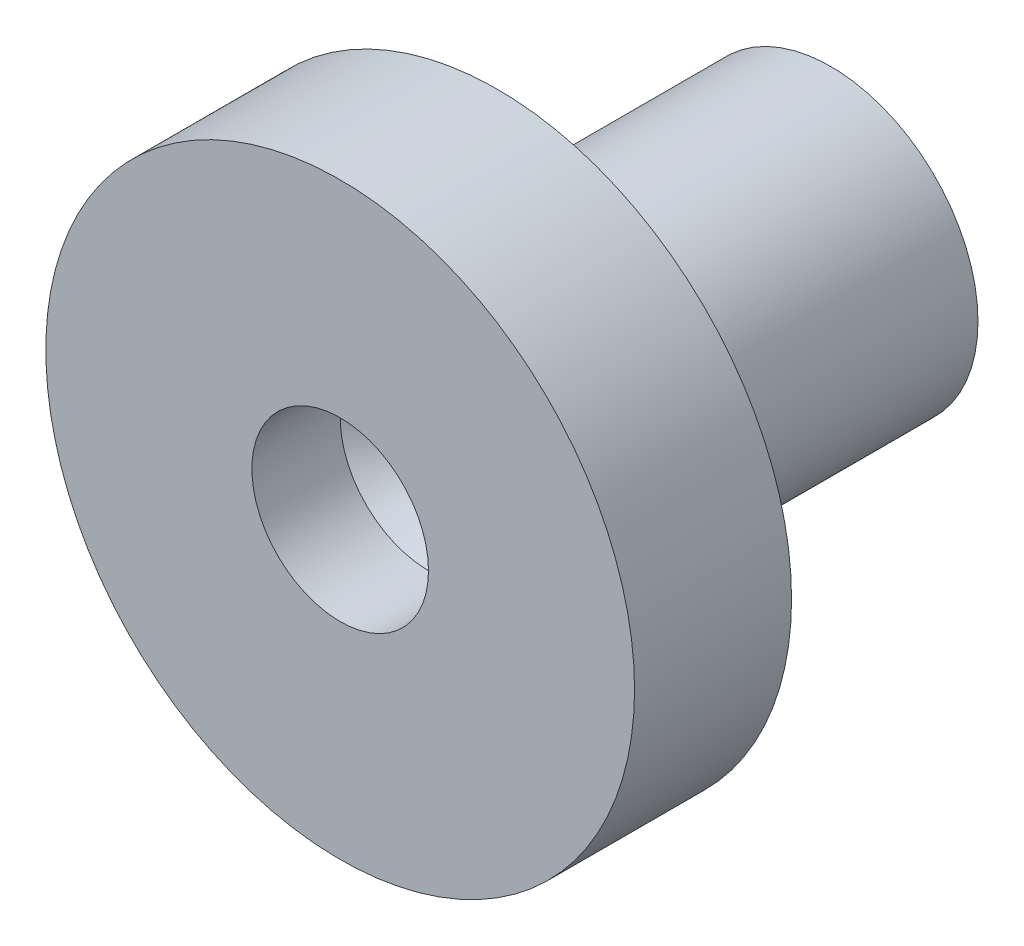
ISO-10303-21;
HEADER;
FILE_DESCRIPTION(('STEP AP214'),'2;1');
FILE_NAME('part.step','',(''),(''),'','','');
FILE_SCHEMA(('AUTOMOTIVE_DESIGN { 1 0 10303 214 1 1 1 1 }'));
ENDSEC;
DATA;
#1=APPLICATION_CONTEXT('core data for automotive mechanical design processes');
#2=APPLICATION_PROTOCOL_DEFINITION('international standard','automotive_design',2000,#1);
#3=PRODUCT_CONTEXT('',#1,'mechanical');
#4=PRODUCT('Part','Part','',(#3));
#5=PRODUCT_RELATED_PRODUCT_CATEGORY('part','',(#4));
#6=PRODUCT_DEFINITION_FORMATION('','',#4);
#7=PRODUCT_DEFINITION_CONTEXT('part definition',#1,'design');
#8=PRODUCT_DEFINITION('design','',#6,#7);
#9=PRODUCT_DEFINITION_SHAPE('','',#8);
#10=(LENGTH_UNIT() NAMED_UNIT(*) SI_UNIT(.MILLI.,.METRE.));
#11=(NAMED_UNIT(*) PLANE_ANGLE_UNIT() SI_UNIT($,.RADIAN.));
#12=(NAMED_UNIT(*) SI_UNIT($,.STERADIAN.) SOLID_ANGLE_UNIT());
#13=UNCERTAINTY_MEASURE_WITH_UNIT(LENGTH_MEASURE(1.E-05),#10,'distance_accuracy_value','');
#14=(GEOMETRIC_REPRESENTATION_CONTEXT(3) GLOBAL_UNCERTAINTY_ASSIGNED_CONTEXT((#13)) GLOBAL_UNIT_ASSIGNED_CONTEXT((#10,
#11,#12)) REPRESENTATION_CONTEXT('',''));
#15=CARTESIAN_POINT('',(0.,0.,0.));
#16=DIRECTION('',(0.,0.,1.));
#17=DIRECTION('',(1.,0.,0.));
#18=AXIS2_PLACEMENT_3D('',#15,#16,#17);
#19=CARTESIAN_POINT('',(0.,0.,17.));
#20=DIRECTION('',(0.,0.,-1.));
#21=DIRECTION('',(-1.,0.,0.));
#22=AXIS2_PLACEMENT_3D('',#19,#20,#21);
#23=CYLINDRICAL_SURFACE('',#22,7.5);
#24=CARTESIAN_POINT('',(0.,0.,14.));
#25=DIRECTION('',(0.,0.,1.));
#26=DIRECTION('',(1.,0.,0.));
#27=AXIS2_PLACEMENT_3D('',#24,#25,#26);
#28=CIRCLE('',#27,7.5);
#29=CARTESIAN_POINT('',(7.5,0.,14.));
#30=VERTEX_POINT('',#29);
#31=EDGE_CURVE('E10',#30,#30,#28,.F.);
#32=ORIENTED_EDGE('',*,*,#31,.T.);
#33=EDGE_LOOP('',(#32));
#34=FACE_BOUND('',#33,.T.);
#35=CARTESIAN_POINT('',(0.,0.,0.));
#36=DIRECTION('',(0.,0.,1.));
#37=DIRECTION('',(1.,0.,0.));
#38=AXIS2_PLACEMENT_3D('',#35,#36,#37);
#39=CIRCLE('',#38,7.5);
#40=CARTESIAN_POINT('',(7.5,0.,0.));
#41=VERTEX_POINT('',#40);
#42=EDGE_CURVE('E39',#41,#41,#39,.T.);
#43=ORIENTED_EDGE('',*,*,#42,.T.);
#44=EDGE_LOOP('',(#43));
#45=FACE_BOUND('',#44,.T.);
#46=ADVANCED_FACE('F28',(#34,#45),#23,.T.);
#47=CARTESIAN_POINT('',(0.,0.,11.5));
#48=DIRECTION('',(0.,0.,1.));
#49=DIRECTION('',(1.,0.,0.));
#50=AXIS2_PLACEMENT_3D('',#47,#48,#49);
#51=CYLINDRICAL_SURFACE('',#50,1.25);
#52=CARTESIAN_POINT('',(0.,0.,17.));
#53=DIRECTION('',(0.,0.,1.));
#54=DIRECTION('',(1.,0.,0.));
#55=AXIS2_PLACEMENT_3D('',#52,#53,#54);
#56=CIRCLE('',#55,1.25);
#57=CARTESIAN_POINT('',(1.25,0.,17.));
#58=VERTEX_POINT('',#57);
#59=EDGE_CURVE('E51',#58,#58,#56,.T.);
#60=ORIENTED_EDGE('',*,*,#59,.F.);
#61=EDGE_LOOP('',(#60));
#62=FACE_BOUND('',#61,.T.);
#63=CARTESIAN_POINT('',(0.,0.,18.));
#64=DIRECTION('',(0.,0.,1.));
#65=DIRECTION('',(1.,0.,0.));
#66=AXIS2_PLACEMENT_3D('',#63,#64,#65);
#67=CIRCLE('',#66,1.25);
#68=CARTESIAN_POINT('',(1.25,0.,18.));
#69=VERTEX_POINT('',#68);
#70=EDGE_CURVE('E46',#69,#69,#67,.F.);
#71=ORIENTED_EDGE('',*,*,#70,.F.);
#72=EDGE_LOOP('',(#71));
#73=FACE_BOUND('',#72,.T.);
#74=ADVANCED_FACE('F98',(#62,#73),#51,.F.);
#75=CARTESIAN_POINT('',(0.,0.,17.));
#76=DIRECTION('',(0.,0.,-1.));
#77=DIRECTION('',(-1.,0.,0.));
#78=AXIS2_PLACEMENT_3D('',#75,#76,#77);
#79=CYLINDRICAL_SURFACE('',#78,4.35);
#80=CARTESIAN_POINT('',(0.,0.,17.));
#81=DIRECTION('',(0.,0.,1.));
#82=DIRECTION('',(1.,0.,0.));
#83=AXIS2_PLACEMENT_3D('',#80,#81,#82);
#84=CIRCLE('',#83,4.35);
#85=CARTESIAN_POINT('',(4.35,0.,17.));
#86=VERTEX_POINT('',#85);
#87=EDGE_CURVE('E54',#86,#86,#84,.T.);
#88=ORIENTED_EDGE('',*,*,#87,.T.);
#89=EDGE_LOOP('',(#88));
#90=FACE_BOUND('',#89,.T.);
#91=CARTESIAN_POINT('',(0.,0.,3.));
#92=DIRECTION('',(0.,0.,-1.));
#93=DIRECTION('',(-1.,0.,0.));
#94=AXIS2_PLACEMENT_3D('',#91,#92,#93);
#95=CIRCLE('',#94,4.35);
#96=CARTESIAN_POINT('',(-4.35,0.,3.));
#97=VERTEX_POINT('',#96);
#98=EDGE_CURVE('E43',#97,#97,#95,.T.);
#99=ORIENTED_EDGE('',*,*,#98,.T.);
#100=EDGE_LOOP('',(#99));
#101=FACE_BOUND('',#100,.T.);
#102=ADVANCED_FACE('F102',(#90,#101),#79,.F.);
#103=CARTESIAN_POINT('',(0.,0.,0.));
#104=DIRECTION('',(0.,0.,1.));
#105=DIRECTION('',(1.,0.,0.));
#106=AXIS2_PLACEMENT_3D('',#103,#104,#105);
#107=PLANE('',#106);
#108=CARTESIAN_POINT('',(0.,0.,0.));
#109=DIRECTION('',(0.,0.,-1.));
#110=DIRECTION('',(-1.,0.,0.));
#111=AXIS2_PLACEMENT_3D('',#108,#109,#110);
#112=CIRCLE('',#111,6.);
#113=CARTESIAN_POINT('',(-6.,0.,0.));
#114=VERTEX_POINT('',#113);
#115=EDGE_CURVE('E58',#114,#114,#112,.T.);
#116=ORIENTED_EDGE('',*,*,#115,.F.);
#117=EDGE_LOOP('',(#116));
#118=FACE_BOUND('',#117,.T.);
#119=ORIENTED_EDGE('',*,*,#42,.F.);
#120=EDGE_LOOP('',(#119));
#121=FACE_BOUND('',#120,.T.);
#122=ADVANCED_FACE('F107',(#118,#121),#107,.F.);
#123=CARTESIAN_POINT('',(0.,0.,3.));
#124=DIRECTION('',(0.,0.,-1.));
#125=DIRECTION('',(-1.,0.,0.));
#126=AXIS2_PLACEMENT_3D('',#123,#124,#125);
#127=CYLINDRICAL_SURFACE('',#126,6.);
#128=CARTESIAN_POINT('',(0.,0.,3.));
#129=DIRECTION('',(0.,0.,-1.));
#130=DIRECTION('',(-1.,0.,0.));
#131=AXIS2_PLACEMENT_3D('',#128,#129,#130);
#132=CIRCLE('',#131,6.);
#133=CARTESIAN_POINT('',(-6.,0.,3.));
#134=VERTEX_POINT('',#133);
#135=EDGE_CURVE('E56',#134,#134,#132,.T.);
#136=ORIENTED_EDGE('',*,*,#135,.F.);
#137=EDGE_LOOP('',(#136));
#138=FACE_BOUND('',#137,.T.);
#139=ORIENTED_EDGE('',*,*,#115,.T.);
#140=EDGE_LOOP('',(#139));
#141=FACE_BOUND('',#140,.T.);
#142=ADVANCED_FACE('F110',(#138,#141),#127,.F.);
#143=CARTESIAN_POINT('',(0.,0.,3.));
#144=DIRECTION('',(0.,0.,-1.));
#145=DIRECTION('',(-1.,0.,0.));
#146=AXIS2_PLACEMENT_3D('',#143,#144,#145);
#147=PLANE('',#146);
#148=ORIENTED_EDGE('',*,*,#98,.F.);
#149=EDGE_LOOP('',(#148));
#150=FACE_BOUND('',#149,.T.);
#151=ORIENTED_EDGE('',*,*,#135,.T.);
#152=EDGE_LOOP('',(#151));
#153=FACE_BOUND('',#152,.T.);
#154=ADVANCED_FACE('F117',(#150,#153),#147,.T.);
#155=CARTESIAN_POINT('',(0.,0.,25.));
#156=DIRECTION('',(0.,0.,1.));
#157=DIRECTION('',(1.,0.,0.));
#158=AXIS2_PLACEMENT_3D('',#155,#156,#157);
#159=PLANE('',#158);
#160=CARTESIAN_POINT('',(0.,0.,25.));
#161=DIRECTION('',(0.,0.,1.));
#162=DIRECTION('',(1.,0.,0.));
#163=AXIS2_PLACEMENT_3D('',#160,#161,#162);
#164=CIRCLE('',#163,4.5);
#165=CARTESIAN_POINT('',(4.5,0.,25.));
#166=VERTEX_POINT('',#165);
#167=EDGE_CURVE('E49',#166,#166,#164,.T.);
#168=ORIENTED_EDGE('',*,*,#167,.F.);
#169=EDGE_LOOP('',(#168));
#170=FACE_BOUND('',#169,.T.);
#171=CARTESIAN_POINT('',(0.,0.,25.));
#172=DIRECTION('',(0.,0.,1.));
#173=DIRECTION('',(1.,0.,0.));
#174=AXIS2_PLACEMENT_3D('',#171,#172,#173);
#175=CIRCLE('',#174,15.);
#176=CARTESIAN_POINT('',(15.,0.,25.));
#177=VERTEX_POINT('',#176);
#178=EDGE_CURVE('E72',#177,#177,#175,.T.);
#179=ORIENTED_EDGE('',*,*,#178,.T.);
#180=EDGE_LOOP('',(#179));
#181=FACE_BOUND('',#180,.T.);
#182=ADVANCED_FACE('F79',(#170,#181),#159,.T.);
#183=CARTESIAN_POINT('',(0.,0.,17.));
#184=DIRECTION('',(0.,0.,1.));
#185=DIRECTION('',(1.,0.,0.));
#186=AXIS2_PLACEMENT_3D('',#183,#184,#185);
#187=PLANE('',#186);
#188=ORIENTED_EDGE('',*,*,#59,.T.);
#189=EDGE_LOOP('',(#188));
#190=FACE_BOUND('',#189,.T.);
#191=ORIENTED_EDGE('',*,*,#87,.F.);
#192=EDGE_LOOP('',(#191));
#193=FACE_BOUND('',#192,.T.);
#194=ADVANCED_FACE('F122',(#190,#193),#187,.F.);
#195=CARTESIAN_POINT('',(0.,0.,20.5));
#196=DIRECTION('',(0.,0.,1.));
#197=DIRECTION('',(1.,0.,0.));
#198=AXIS2_PLACEMENT_3D('',#195,#196,#197);
#199=CYLINDRICAL_SURFACE('',#198,4.5);
#200=CARTESIAN_POINT('',(0.,0.,20.5));
#201=DIRECTION('',(0.,0.,1.));
#202=DIRECTION('',(1.,0.,0.));
#203=AXIS2_PLACEMENT_3D('',#200,#201,#202);
#204=CIRCLE('',#203,4.5);
#205=CARTESIAN_POINT('',(4.5,0.,20.5));
#206=VERTEX_POINT('',#205);
#207=EDGE_CURVE('E69',#206,#206,#204,.T.);
#208=ORIENTED_EDGE('',*,*,#207,.F.);
#209=EDGE_LOOP('',(#208));
#210=FACE_BOUND('',#209,.T.);
#211=ORIENTED_EDGE('',*,*,#167,.T.);
#212=EDGE_LOOP('',(#211));
#213=FACE_BOUND('',#212,.T.);
#214=ADVANCED_FACE('F125',(#210,#213),#199,.F.);
#215=CARTESIAN_POINT('',(0.,0.,18.));
#216=DIRECTION('',(0.,0.,1.));
#217=DIRECTION('',(1.,0.,0.));
#218=AXIS2_PLACEMENT_3D('',#215,#216,#217);
#219=PLANE('',#218);
#220=CARTESIAN_POINT('',(0.,0.,18.));
#221=DIRECTION('',(0.,0.,1.));
#222=DIRECTION('',(1.,0.,0.));
#223=AXIS2_PLACEMENT_3D('',#220,#221,#222);
#224=CIRCLE('',#223,1.52061601851447);
#225=CARTESIAN_POINT('',(1.52061601851447,0.,18.));
#226=VERTEX_POINT('',#225);
#227=EDGE_CURVE('E50',#226,#226,#224,.T.);
#228=ORIENTED_EDGE('',*,*,#227,.T.);
#229=EDGE_LOOP('',(#228));
#230=FACE_BOUND('',#229,.T.);
#231=ORIENTED_EDGE('',*,*,#70,.T.);
#232=EDGE_LOOP('',(#231));
#233=FACE_BOUND('',#232,.T.);
#234=ADVANCED_FACE('F94',(#230,#233),#219,.T.);
#235=CARTESIAN_POINT('',(0.,0.,20.5));
#236=DIRECTION('',(0.,0.,1.));
#237=DIRECTION('',(1.,0.,0.));
#238=AXIS2_PLACEMENT_3D('',#235,#236,#237);
#239=CONICAL_SURFACE('',#238,4.5,0.872664625997167);
#240=ORIENTED_EDGE('',*,*,#227,.F.);
#241=EDGE_LOOP('',(#240));
#242=FACE_BOUND('',#241,.T.);
#243=ORIENTED_EDGE('',*,*,#207,.T.);
#244=EDGE_LOOP('',(#243));
#245=FACE_BOUND('',#244,.T.);
#246=ADVANCED_FACE('F89',(#242,#245),#239,.F.);
#247=CARTESIAN_POINT('',(0.,0.,17.));
#248=DIRECTION('',(0.,0.,1.));
#249=DIRECTION('',(1.,0.,0.));
#250=AXIS2_PLACEMENT_3D('',#247,#248,#249);
#251=PLANE('',#250);
#252=CARTESIAN_POINT('',(0.,0.,17.));
#253=DIRECTION('',(0.,0.,1.));
#254=DIRECTION('',(1.,0.,0.));
#255=AXIS2_PLACEMENT_3D('',#252,#253,#254);
#256=CIRCLE('',#255,10.5);
#257=CARTESIAN_POINT('',(10.5,0.,17.));
#258=VERTEX_POINT('',#257);
#259=EDGE_CURVE('E35',#258,#258,#256,.T.);
#260=ORIENTED_EDGE('',*,*,#259,.T.);
#261=EDGE_LOOP('',(#260));
#262=FACE_BOUND('',#261,.T.);
#263=CARTESIAN_POINT('',(0.,0.,17.));
#264=DIRECTION('',(0.,0.,1.));
#265=DIRECTION('',(1.,0.,0.));
#266=AXIS2_PLACEMENT_3D('',#263,#264,#265);
#267=CIRCLE('',#266,15.);
#268=CARTESIAN_POINT('',(15.,0.,17.));
#269=VERTEX_POINT('',#268);
#270=EDGE_CURVE('E73',#269,#269,#267,.T.);
#271=ORIENTED_EDGE('',*,*,#270,.F.);
#272=EDGE_LOOP('',(#271));
#273=FACE_BOUND('',#272,.T.);
#274=ADVANCED_FACE('F84',(#262,#273),#251,.F.);
#275=CARTESIAN_POINT('',(0.,0.,25.));
#276=DIRECTION('',(0.,0.,-1.));
#277=DIRECTION('',(-1.,0.,0.));
#278=AXIS2_PLACEMENT_3D('',#275,#276,#277);
#279=CYLINDRICAL_SURFACE('',#278,15.);
#280=ORIENTED_EDGE('',*,*,#178,.F.);
#281=EDGE_LOOP('',(#280));
#282=FACE_BOUND('',#281,.T.);
#283=ORIENTED_EDGE('',*,*,#270,.T.);
#284=EDGE_LOOP('',(#283));
#285=FACE_BOUND('',#284,.T.);
#286=ADVANCED_FACE('F81',(#282,#285),#279,.T.);
#287=CARTESIAN_POINT('',(0.,0.,14.));
#288=DIRECTION('',(0.,0.,1.));
#289=DIRECTION('',(1.,0.,0.));
#290=AXIS2_PLACEMENT_3D('',#287,#288,#289);
#291=TOROIDAL_SURFACE('',#290,10.5,3.);
#292=ORIENTED_EDGE('',*,*,#31,.F.);
#293=EDGE_LOOP('',(#292));
#294=FACE_BOUND('',#293,.T.);
#295=ORIENTED_EDGE('',*,*,#259,.F.);
#296=EDGE_LOOP('',(#295));
#297=FACE_BOUND('',#296,.T.);
#298=ADVANCED_FACE('F30',(#294,#297),#291,.F.);
#299=CLOSED_SHELL('',(#46,#74,#102,#122,#142,#154,#182,#194,#214,#234,#246,#274,#286,#298));
#300=MANIFOLD_SOLID_BREP('B2',#299);
#301=ADVANCED_BREP_SHAPE_REPRESENTATION('',(#18,#300),#14);
#302=SHAPE_DEFINITION_REPRESENTATION(#9,#301);
ENDSEC;
END-ISO-10303-21;
